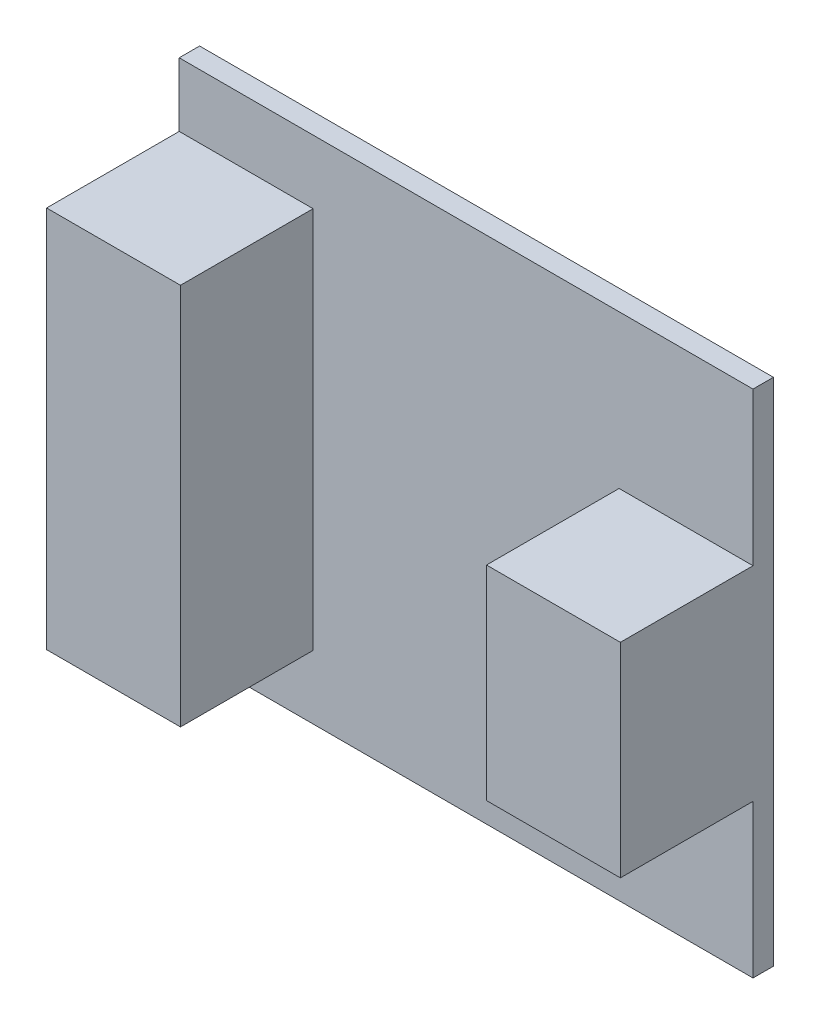
ISO-10303-21;
HEADER;
FILE_DESCRIPTION(('STEP AP214'),'2;1');
FILE_NAME('part.step','',(''),(''),'','','');
FILE_SCHEMA(('AUTOMOTIVE_DESIGN { 1 0 10303 214 1 1 1 1 }'));
ENDSEC;
DATA;
#1=APPLICATION_CONTEXT('core data for automotive mechanical design processes');
#2=APPLICATION_PROTOCOL_DEFINITION('international standard','automotive_design',2000,#1);
#3=PRODUCT_CONTEXT('',#1,'mechanical');
#4=PRODUCT('Part','Part','',(#3));
#5=PRODUCT_RELATED_PRODUCT_CATEGORY('part','',(#4));
#6=PRODUCT_DEFINITION_FORMATION('','',#4);
#7=PRODUCT_DEFINITION_CONTEXT('part definition',#1,'design');
#8=PRODUCT_DEFINITION('design','',#6,#7);
#9=PRODUCT_DEFINITION_SHAPE('','',#8);
#10=(LENGTH_UNIT() NAMED_UNIT(*) SI_UNIT(.MILLI.,.METRE.));
#11=(NAMED_UNIT(*) PLANE_ANGLE_UNIT() SI_UNIT($,.RADIAN.));
#12=(NAMED_UNIT(*) SI_UNIT($,.STERADIAN.) SOLID_ANGLE_UNIT());
#13=UNCERTAINTY_MEASURE_WITH_UNIT(LENGTH_MEASURE(1.E-05),#10,'distance_accuracy_value','');
#14=(GEOMETRIC_REPRESENTATION_CONTEXT(3) GLOBAL_UNCERTAINTY_ASSIGNED_CONTEXT((#13)) GLOBAL_UNIT_ASSIGNED_CONTEXT((#10,
#11,#12)) REPRESENTATION_CONTEXT('',''));
#15=CARTESIAN_POINT('',(0.,0.,0.));
#16=DIRECTION('',(0.,0.,1.));
#17=DIRECTION('',(1.,0.,0.));
#18=AXIS2_PLACEMENT_3D('',#15,#16,#17);
#19=CARTESIAN_POINT('',(-22.5,20.,1.6));
#20=DIRECTION('',(1.,0.,0.));
#21=DIRECTION('',(0.,0.,-1.));
#22=AXIS2_PLACEMENT_3D('',#19,#20,#21);
#23=PLANE('',#22);
#24=DIRECTION('',(0.,-1.,0.));
#25=VECTOR('',#24,1.);
#26=CARTESIAN_POINT('',(-22.5,20.,0.));
#27=LINE('',#26,#25);
#28=CARTESIAN_POINT('',(-22.5,20.,0.));
#29=VERTEX_POINT('',#28);
#30=CARTESIAN_POINT('',(-22.5,-20.,0.));
#31=VERTEX_POINT('',#30);
#32=EDGE_CURVE('E182',#29,#31,#27,.T.);
#33=ORIENTED_EDGE('',*,*,#32,.T.);
#34=DIRECTION('',(0.,0.,-1.));
#35=VECTOR('',#34,1.);
#36=CARTESIAN_POINT('',(-22.5,-20.,1.6));
#37=LINE('',#36,#35);
#38=CARTESIAN_POINT('',(-22.5,-20.,1.6));
#39=VERTEX_POINT('',#38);
#40=EDGE_CURVE('E11',#39,#31,#37,.T.);
#41=ORIENTED_EDGE('',*,*,#40,.F.);
#42=DIRECTION('',(0.,-1.,0.));
#43=VECTOR('',#42,1.);
#44=CARTESIAN_POINT('',(-22.5,20.,1.6));
#45=LINE('',#44,#43);
#46=CARTESIAN_POINT('',(-22.5,-15.,1.6));
#47=VERTEX_POINT('',#46);
#48=EDGE_CURVE('E183',#47,#39,#45,.T.);
#49=ORIENTED_EDGE('',*,*,#48,.F.);
#50=DIRECTION('',(0.,0.,-1.));
#51=VECTOR('',#50,1.);
#52=CARTESIAN_POINT('',(-22.5,-15.,12.));
#53=LINE('',#52,#51);
#54=CARTESIAN_POINT('',(-22.5,-15.,12.));
#55=VERTEX_POINT('',#54);
#56=EDGE_CURVE('E178',#55,#47,#53,.T.);
#57=ORIENTED_EDGE('',*,*,#56,.F.);
#58=DIRECTION('',(0.,-1.,0.));
#59=VECTOR('',#58,1.);
#60=CARTESIAN_POINT('',(-22.5,15.,12.));
#61=LINE('',#60,#59);
#62=CARTESIAN_POINT('',(-22.5,15.,12.));
#63=VERTEX_POINT('',#62);
#64=EDGE_CURVE('E158',#63,#55,#61,.T.);
#65=ORIENTED_EDGE('',*,*,#64,.F.);
#66=DIRECTION('',(0.,0.,-1.));
#67=VECTOR('',#66,1.);
#68=CARTESIAN_POINT('',(-22.5,15.,12.));
#69=LINE('',#68,#67);
#70=CARTESIAN_POINT('',(-22.5,15.,1.6));
#71=VERTEX_POINT('',#70);
#72=EDGE_CURVE('E167',#63,#71,#69,.T.);
#73=ORIENTED_EDGE('',*,*,#72,.T.);
#74=CARTESIAN_POINT('',(-22.5,20.,1.6));
#75=VERTEX_POINT('',#74);
#76=EDGE_CURVE('E185',#75,#71,#45,.T.);
#77=ORIENTED_EDGE('',*,*,#76,.F.);
#78=DIRECTION('',(0.,0.,-1.));
#79=VECTOR('',#78,1.);
#80=CARTESIAN_POINT('',(-22.5,20.,1.6));
#81=LINE('',#80,#79);
#82=EDGE_CURVE('E193',#75,#29,#81,.T.);
#83=ORIENTED_EDGE('',*,*,#82,.T.);
#84=EDGE_LOOP('',(#33,#41,#49,#57,#65,#73,#77,#83));
#85=FACE_BOUND('',#84,.T.);
#86=ADVANCED_FACE('F39',(#85),#23,.F.);
#87=CARTESIAN_POINT('',(-22.5,-20.,1.6));
#88=DIRECTION('',(0.,1.,0.));
#89=DIRECTION('',(0.,0.,1.));
#90=AXIS2_PLACEMENT_3D('',#87,#88,#89);
#91=PLANE('',#90);
#92=DIRECTION('',(1.,0.,0.));
#93=VECTOR('',#92,1.);
#94=CARTESIAN_POINT('',(-22.5,-20.,0.));
#95=LINE('',#94,#93);
#96=CARTESIAN_POINT('',(22.5,-20.,0.));
#97=VERTEX_POINT('',#96);
#98=EDGE_CURVE('E198',#31,#97,#95,.T.);
#99=ORIENTED_EDGE('',*,*,#98,.T.);
#100=DIRECTION('',(0.,0.,-1.));
#101=VECTOR('',#100,1.);
#102=CARTESIAN_POINT('',(22.5,-20.,1.6));
#103=LINE('',#102,#101);
#104=CARTESIAN_POINT('',(22.5,-20.,1.6));
#105=VERTEX_POINT('',#104);
#106=EDGE_CURVE('E46',#105,#97,#103,.T.);
#107=ORIENTED_EDGE('',*,*,#106,.F.);
#108=DIRECTION('',(1.,0.,0.));
#109=VECTOR('',#108,1.);
#110=CARTESIAN_POINT('',(-22.5,-20.,1.6));
#111=LINE('',#110,#109);
#112=EDGE_CURVE('E184',#39,#105,#111,.T.);
#113=ORIENTED_EDGE('',*,*,#112,.F.);
#114=ORIENTED_EDGE('',*,*,#40,.T.);
#115=EDGE_LOOP('',(#99,#107,#113,#114));
#116=FACE_BOUND('',#115,.T.);
#117=ADVANCED_FACE('F245',(#116),#91,.F.);
#118=CARTESIAN_POINT('',(22.5,-20.,1.6));
#119=DIRECTION('',(-1.,0.,0.));
#120=DIRECTION('',(0.,0.,1.));
#121=AXIS2_PLACEMENT_3D('',#118,#119,#120);
#122=PLANE('',#121);
#123=DIRECTION('',(0.,1.,0.));
#124=VECTOR('',#123,1.);
#125=CARTESIAN_POINT('',(22.5,-20.,0.));
#126=LINE('',#125,#124);
#127=CARTESIAN_POINT('',(22.5,20.,0.));
#128=VERTEX_POINT('',#127);
#129=EDGE_CURVE('E196',#97,#128,#126,.T.);
#130=ORIENTED_EDGE('',*,*,#129,.T.);
#131=DIRECTION('',(0.,0.,-1.));
#132=VECTOR('',#131,1.);
#133=CARTESIAN_POINT('',(22.5,20.,1.6));
#134=LINE('',#133,#132);
#135=CARTESIAN_POINT('',(22.5,20.,1.6));
#136=VERTEX_POINT('',#135);
#137=EDGE_CURVE('E204',#136,#128,#134,.T.);
#138=ORIENTED_EDGE('',*,*,#137,.F.);
#139=DIRECTION('',(0.,1.,0.));
#140=VECTOR('',#139,1.);
#141=CARTESIAN_POINT('',(22.5,-20.,1.6));
#142=LINE('',#141,#140);
#143=CARTESIAN_POINT('',(22.5,8.,1.6));
#144=VERTEX_POINT('',#143);
#145=EDGE_CURVE('E190',#144,#136,#142,.T.);
#146=ORIENTED_EDGE('',*,*,#145,.F.);
#147=DIRECTION('',(0.,0.,-1.));
#148=VECTOR('',#147,1.);
#149=CARTESIAN_POINT('',(22.5,8.,12.));
#150=LINE('',#149,#148);
#151=CARTESIAN_POINT('',(22.5,8.,12.));
#152=VERTEX_POINT('',#151);
#153=EDGE_CURVE('E152',#152,#144,#150,.T.);
#154=ORIENTED_EDGE('',*,*,#153,.F.);
#155=DIRECTION('',(0.,1.,0.));
#156=VECTOR('',#155,1.);
#157=CARTESIAN_POINT('',(22.5,-8.,12.));
#158=LINE('',#157,#156);
#159=CARTESIAN_POINT('',(22.5,-8.,12.));
#160=VERTEX_POINT('',#159);
#161=EDGE_CURVE('E140',#160,#152,#158,.T.);
#162=ORIENTED_EDGE('',*,*,#161,.F.);
#163=DIRECTION('',(0.,0.,-1.));
#164=VECTOR('',#163,1.);
#165=CARTESIAN_POINT('',(22.5,-8.,12.));
#166=LINE('',#165,#164);
#167=CARTESIAN_POINT('',(22.5,-8.,1.6));
#168=VERTEX_POINT('',#167);
#169=EDGE_CURVE('E131',#160,#168,#166,.T.);
#170=ORIENTED_EDGE('',*,*,#169,.T.);
#171=EDGE_CURVE('E189',#105,#168,#142,.T.);
#172=ORIENTED_EDGE('',*,*,#171,.F.);
#173=ORIENTED_EDGE('',*,*,#106,.T.);
#174=EDGE_LOOP('',(#130,#138,#146,#154,#162,#170,#172,#173));
#175=FACE_BOUND('',#174,.T.);
#176=ADVANCED_FACE('F211',(#175),#122,.F.);
#177=CARTESIAN_POINT('',(22.5,20.,1.6));
#178=DIRECTION('',(0.,-1.,0.));
#179=DIRECTION('',(0.,0.,-1.));
#180=AXIS2_PLACEMENT_3D('',#177,#178,#179);
#181=PLANE('',#180);
#182=DIRECTION('',(-1.,0.,0.));
#183=VECTOR('',#182,1.);
#184=CARTESIAN_POINT('',(22.5,20.,0.));
#185=LINE('',#184,#183);
#186=EDGE_CURVE('E199',#128,#29,#185,.T.);
#187=ORIENTED_EDGE('',*,*,#186,.T.);
#188=ORIENTED_EDGE('',*,*,#82,.F.);
#189=DIRECTION('',(-1.,0.,0.));
#190=VECTOR('',#189,1.);
#191=CARTESIAN_POINT('',(22.5,20.,1.6));
#192=LINE('',#191,#190);
#193=EDGE_CURVE('E192',#136,#75,#192,.T.);
#194=ORIENTED_EDGE('',*,*,#193,.F.);
#195=ORIENTED_EDGE('',*,*,#137,.T.);
#196=EDGE_LOOP('',(#187,#188,#194,#195));
#197=FACE_BOUND('',#196,.T.);
#198=ADVANCED_FACE('F222',(#197),#181,.F.);
#199=CARTESIAN_POINT('',(0.,0.,1.6));
#200=DIRECTION('',(0.,0.,1.));
#201=DIRECTION('',(1.,0.,0.));
#202=AXIS2_PLACEMENT_3D('',#199,#200,#201);
#203=PLANE('',#202);
#204=DIRECTION('',(-1.,0.,0.));
#205=VECTOR('',#204,1.);
#206=CARTESIAN_POINT('',(22.5,8.,1.6));
#207=LINE('',#206,#205);
#208=CARTESIAN_POINT('',(12.,8.,1.6));
#209=VERTEX_POINT('',#208);
#210=EDGE_CURVE('E141',#144,#209,#207,.T.);
#211=ORIENTED_EDGE('',*,*,#210,.F.);
#212=ORIENTED_EDGE('',*,*,#145,.T.);
#213=ORIENTED_EDGE('',*,*,#193,.T.);
#214=ORIENTED_EDGE('',*,*,#76,.T.);
#215=DIRECTION('',(-1.,0.,0.));
#216=VECTOR('',#215,1.);
#217=CARTESIAN_POINT('',(-12.,15.,1.6));
#218=LINE('',#217,#216);
#219=CARTESIAN_POINT('',(-12.,15.,1.6));
#220=VERTEX_POINT('',#219);
#221=EDGE_CURVE('E62',#220,#71,#218,.T.);
#222=ORIENTED_EDGE('',*,*,#221,.F.);
#223=DIRECTION('',(0.,1.,0.));
#224=VECTOR('',#223,1.);
#225=CARTESIAN_POINT('',(-12.,-15.,1.6));
#226=LINE('',#225,#224);
#227=CARTESIAN_POINT('',(-12.,-15.,1.6));
#228=VERTEX_POINT('',#227);
#229=EDGE_CURVE('E155',#228,#220,#226,.T.);
#230=ORIENTED_EDGE('',*,*,#229,.F.);
#231=DIRECTION('',(1.,0.,0.));
#232=VECTOR('',#231,1.);
#233=CARTESIAN_POINT('',(-22.5,-15.,1.6));
#234=LINE('',#233,#232);
#235=EDGE_CURVE('E149',#47,#228,#234,.T.);
#236=ORIENTED_EDGE('',*,*,#235,.F.);
#237=ORIENTED_EDGE('',*,*,#48,.T.);
#238=ORIENTED_EDGE('',*,*,#112,.T.);
#239=ORIENTED_EDGE('',*,*,#171,.T.);
#240=DIRECTION('',(1.,0.,0.));
#241=VECTOR('',#240,1.);
#242=CARTESIAN_POINT('',(12.,-8.,1.6));
#243=LINE('',#242,#241);
#244=CARTESIAN_POINT('',(12.,-8.,1.6));
#245=VERTEX_POINT('',#244);
#246=EDGE_CURVE('E364',#245,#168,#243,.T.);
#247=ORIENTED_EDGE('',*,*,#246,.F.);
#248=DIRECTION('',(0.,-1.,0.));
#249=VECTOR('',#248,1.);
#250=CARTESIAN_POINT('',(12.,8.,1.6));
#251=LINE('',#250,#249);
#252=EDGE_CURVE('E150',#209,#245,#251,.T.);
#253=ORIENTED_EDGE('',*,*,#252,.F.);
#254=EDGE_LOOP('',(#211,#212,#213,#214,#222,#230,#236,#237,#238,#239,#247,#253));
#255=FACE_BOUND('',#254,.T.);
#256=ADVANCED_FACE('F226',(#255),#203,.T.);
#257=CARTESIAN_POINT('',(0.,0.,0.));
#258=DIRECTION('',(0.,0.,1.));
#259=DIRECTION('',(1.,0.,0.));
#260=AXIS2_PLACEMENT_3D('',#257,#258,#259);
#261=PLANE('',#260);
#262=ORIENTED_EDGE('',*,*,#32,.F.);
#263=ORIENTED_EDGE('',*,*,#186,.F.);
#264=ORIENTED_EDGE('',*,*,#129,.F.);
#265=ORIENTED_EDGE('',*,*,#98,.F.);
#266=EDGE_LOOP('',(#262,#263,#264,#265));
#267=FACE_BOUND('',#266,.T.);
#268=ADVANCED_FACE('F217',(#267),#261,.F.);
#269=CARTESIAN_POINT('',(-22.5,-15.,12.));
#270=DIRECTION('',(0.,1.,0.));
#271=DIRECTION('',(0.,0.,1.));
#272=AXIS2_PLACEMENT_3D('',#269,#270,#271);
#273=PLANE('',#272);
#274=ORIENTED_EDGE('',*,*,#235,.T.);
#275=DIRECTION('',(0.,0.,-1.));
#276=VECTOR('',#275,1.);
#277=CARTESIAN_POINT('',(-12.,-15.,12.));
#278=LINE('',#277,#276);
#279=CARTESIAN_POINT('',(-12.,-15.,12.));
#280=VERTEX_POINT('',#279);
#281=EDGE_CURVE('E173',#280,#228,#278,.T.);
#282=ORIENTED_EDGE('',*,*,#281,.F.);
#283=DIRECTION('',(1.,0.,0.));
#284=VECTOR('',#283,1.);
#285=CARTESIAN_POINT('',(-22.5,-15.,12.));
#286=LINE('',#285,#284);
#287=EDGE_CURVE('E161',#55,#280,#286,.T.);
#288=ORIENTED_EDGE('',*,*,#287,.F.);
#289=ORIENTED_EDGE('',*,*,#56,.T.);
#290=EDGE_LOOP('',(#274,#282,#288,#289));
#291=FACE_BOUND('',#290,.T.);
#292=ADVANCED_FACE('F238',(#291),#273,.F.);
#293=CARTESIAN_POINT('',(-12.,-15.,12.));
#294=DIRECTION('',(-1.,0.,0.));
#295=DIRECTION('',(0.,0.,1.));
#296=AXIS2_PLACEMENT_3D('',#293,#294,#295);
#297=PLANE('',#296);
#298=ORIENTED_EDGE('',*,*,#229,.T.);
#299=DIRECTION('',(0.,0.,-1.));
#300=VECTOR('',#299,1.);
#301=CARTESIAN_POINT('',(-12.,15.,12.));
#302=LINE('',#301,#300);
#303=CARTESIAN_POINT('',(-12.,15.,12.));
#304=VERTEX_POINT('',#303);
#305=EDGE_CURVE('E175',#304,#220,#302,.T.);
#306=ORIENTED_EDGE('',*,*,#305,.F.);
#307=DIRECTION('',(0.,1.,0.));
#308=VECTOR('',#307,1.);
#309=CARTESIAN_POINT('',(-12.,-15.,12.));
#310=LINE('',#309,#308);
#311=EDGE_CURVE('E162',#280,#304,#310,.T.);
#312=ORIENTED_EDGE('',*,*,#311,.F.);
#313=ORIENTED_EDGE('',*,*,#281,.T.);
#314=EDGE_LOOP('',(#298,#306,#312,#313));
#315=FACE_BOUND('',#314,.T.);
#316=ADVANCED_FACE('F237',(#315),#297,.F.);
#317=CARTESIAN_POINT('',(-12.,15.,12.));
#318=DIRECTION('',(0.,-1.,0.));
#319=DIRECTION('',(0.,0.,-1.));
#320=AXIS2_PLACEMENT_3D('',#317,#318,#319);
#321=PLANE('',#320);
#322=ORIENTED_EDGE('',*,*,#221,.T.);
#323=ORIENTED_EDGE('',*,*,#72,.F.);
#324=DIRECTION('',(-1.,0.,0.));
#325=VECTOR('',#324,1.);
#326=CARTESIAN_POINT('',(-12.,15.,12.));
#327=LINE('',#326,#325);
#328=EDGE_CURVE('E164',#304,#63,#327,.T.);
#329=ORIENTED_EDGE('',*,*,#328,.F.);
#330=ORIENTED_EDGE('',*,*,#305,.T.);
#331=EDGE_LOOP('',(#322,#323,#329,#330));
#332=FACE_BOUND('',#331,.T.);
#333=ADVANCED_FACE('F232',(#332),#321,.F.);
#334=CARTESIAN_POINT('',(0.,0.,12.));
#335=DIRECTION('',(0.,0.,1.));
#336=DIRECTION('',(1.,0.,0.));
#337=AXIS2_PLACEMENT_3D('',#334,#335,#336);
#338=PLANE('',#337);
#339=ORIENTED_EDGE('',*,*,#64,.T.);
#340=ORIENTED_EDGE('',*,*,#287,.T.);
#341=ORIENTED_EDGE('',*,*,#311,.T.);
#342=ORIENTED_EDGE('',*,*,#328,.T.);
#343=EDGE_LOOP('',(#339,#340,#341,#342));
#344=FACE_BOUND('',#343,.T.);
#345=ADVANCED_FACE('F265',(#344),#338,.T.);
#346=CARTESIAN_POINT('',(12.,8.,12.));
#347=DIRECTION('',(1.,0.,0.));
#348=DIRECTION('',(0.,0.,-1.));
#349=AXIS2_PLACEMENT_3D('',#346,#347,#348);
#350=PLANE('',#349);
#351=ORIENTED_EDGE('',*,*,#252,.T.);
#352=DIRECTION('',(0.,0.,-1.));
#353=VECTOR('',#352,1.);
#354=CARTESIAN_POINT('',(12.,-8.,12.));
#355=LINE('',#354,#353);
#356=CARTESIAN_POINT('',(12.,-8.,12.));
#357=VERTEX_POINT('',#356);
#358=EDGE_CURVE('E135',#357,#245,#355,.T.);
#359=ORIENTED_EDGE('',*,*,#358,.F.);
#360=DIRECTION('',(0.,-1.,0.));
#361=VECTOR('',#360,1.);
#362=CARTESIAN_POINT('',(12.,8.,12.));
#363=LINE('',#362,#361);
#364=CARTESIAN_POINT('',(12.,8.,12.));
#365=VERTEX_POINT('',#364);
#366=EDGE_CURVE('E138',#365,#357,#363,.T.);
#367=ORIENTED_EDGE('',*,*,#366,.F.);
#368=DIRECTION('',(0.,0.,-1.));
#369=VECTOR('',#368,1.);
#370=CARTESIAN_POINT('',(12.,8.,12.));
#371=LINE('',#370,#369);
#372=EDGE_CURVE('E52',#365,#209,#371,.T.);
#373=ORIENTED_EDGE('',*,*,#372,.T.);
#374=EDGE_LOOP('',(#351,#359,#367,#373));
#375=FACE_BOUND('',#374,.T.);
#376=ADVANCED_FACE('F144',(#375),#350,.F.);
#377=CARTESIAN_POINT('',(12.,-8.,12.));
#378=DIRECTION('',(0.,1.,0.));
#379=DIRECTION('',(0.,0.,1.));
#380=AXIS2_PLACEMENT_3D('',#377,#378,#379);
#381=PLANE('',#380);
#382=ORIENTED_EDGE('',*,*,#246,.T.);
#383=ORIENTED_EDGE('',*,*,#169,.F.);
#384=DIRECTION('',(1.,0.,0.));
#385=VECTOR('',#384,1.);
#386=CARTESIAN_POINT('',(12.,-8.,12.));
#387=LINE('',#386,#385);
#388=EDGE_CURVE('E126',#357,#160,#387,.T.);
#389=ORIENTED_EDGE('',*,*,#388,.F.);
#390=ORIENTED_EDGE('',*,*,#358,.T.);
#391=EDGE_LOOP('',(#382,#383,#389,#390));
#392=FACE_BOUND('',#391,.T.);
#393=ADVANCED_FACE('F128',(#392),#381,.F.);
#394=CARTESIAN_POINT('',(22.5,8.,12.));
#395=DIRECTION('',(0.,-1.,0.));
#396=DIRECTION('',(0.,0.,-1.));
#397=AXIS2_PLACEMENT_3D('',#394,#395,#396);
#398=PLANE('',#397);
#399=ORIENTED_EDGE('',*,*,#210,.T.);
#400=ORIENTED_EDGE('',*,*,#372,.F.);
#401=DIRECTION('',(-1.,0.,0.));
#402=VECTOR('',#401,1.);
#403=CARTESIAN_POINT('',(22.5,8.,12.));
#404=LINE('',#403,#402);
#405=EDGE_CURVE('E142',#152,#365,#404,.T.);
#406=ORIENTED_EDGE('',*,*,#405,.F.);
#407=ORIENTED_EDGE('',*,*,#153,.T.);
#408=EDGE_LOOP('',(#399,#400,#406,#407));
#409=FACE_BOUND('',#408,.T.);
#410=ADVANCED_FACE('F269',(#409),#398,.F.);
#411=CARTESIAN_POINT('',(0.,0.,12.));
#412=DIRECTION('',(0.,0.,1.));
#413=DIRECTION('',(1.,0.,0.));
#414=AXIS2_PLACEMENT_3D('',#411,#412,#413);
#415=PLANE('',#414);
#416=ORIENTED_EDGE('',*,*,#366,.T.);
#417=ORIENTED_EDGE('',*,*,#388,.T.);
#418=ORIENTED_EDGE('',*,*,#161,.T.);
#419=ORIENTED_EDGE('',*,*,#405,.T.);
#420=EDGE_LOOP('',(#416,#417,#418,#419));
#421=FACE_BOUND('',#420,.T.);
#422=ADVANCED_FACE('F136',(#421),#415,.T.);
#423=CLOSED_SHELL('',(#86,#117,#176,#198,#256,#268,#292,#316,#333,#345,#376,#393,#410,#422));
#424=MANIFOLD_SOLID_BREP('B2',#423);
#425=ADVANCED_BREP_SHAPE_REPRESENTATION('',(#18,#424),#14);
#426=SHAPE_DEFINITION_REPRESENTATION(#9,#425);
ENDSEC;
END-ISO-10303-21;
